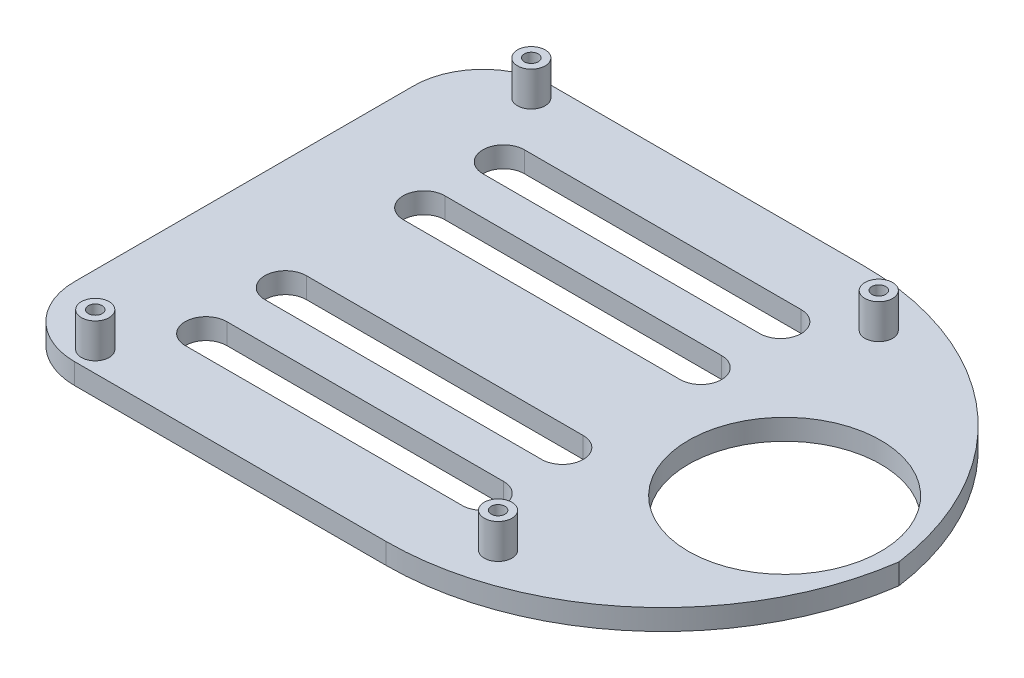
ISO-10303-21;
HEADER;
FILE_DESCRIPTION(('STEP AP214'),'2;1');
FILE_NAME('part.step','',(''),(''),'','','');
FILE_SCHEMA(('AUTOMOTIVE_DESIGN { 1 0 10303 214 1 1 1 1 }'));
ENDSEC;
DATA;
#1=APPLICATION_CONTEXT('core data for automotive mechanical design processes');
#2=APPLICATION_PROTOCOL_DEFINITION('international standard','automotive_design',2000,#1);
#3=PRODUCT_CONTEXT('',#1,'mechanical');
#4=PRODUCT('Part','Part','',(#3));
#5=PRODUCT_RELATED_PRODUCT_CATEGORY('part','',(#4));
#6=PRODUCT_DEFINITION_FORMATION('','',#4);
#7=PRODUCT_DEFINITION_CONTEXT('part definition',#1,'design');
#8=PRODUCT_DEFINITION('design','',#6,#7);
#9=PRODUCT_DEFINITION_SHAPE('','',#8);
#10=(LENGTH_UNIT() NAMED_UNIT(*) SI_UNIT(.MILLI.,.METRE.));
#11=(NAMED_UNIT(*) PLANE_ANGLE_UNIT() SI_UNIT($,.RADIAN.));
#12=(NAMED_UNIT(*) SI_UNIT($,.STERADIAN.) SOLID_ANGLE_UNIT());
#13=UNCERTAINTY_MEASURE_WITH_UNIT(LENGTH_MEASURE(1.E-05),#10,'distance_accuracy_value','');
#14=(GEOMETRIC_REPRESENTATION_CONTEXT(3) GLOBAL_UNCERTAINTY_ASSIGNED_CONTEXT((#13)) GLOBAL_UNIT_ASSIGNED_CONTEXT((#10,
#11,#12)) REPRESENTATION_CONTEXT('',''));
#15=CARTESIAN_POINT('',(0.,0.,0.));
#16=DIRECTION('',(0.,0.,1.));
#17=DIRECTION('',(1.,0.,0.));
#18=AXIS2_PLACEMENT_3D('',#15,#16,#17);
#19=CARTESIAN_POINT('',(-47.5,3.,-34.5));
#20=DIRECTION('',(0.,0.,1.));
#21=DIRECTION('',(1.,0.,0.));
#22=AXIS2_PLACEMENT_3D('',#19,#20,#21);
#23=PLANE('',#22);
#24=DIRECTION('',(-1.,0.,0.));
#25=VECTOR('',#24,1.);
#26=CARTESIAN_POINT('',(-47.5,0.,-34.5));
#27=LINE('',#26,#25);
#28=CARTESIAN_POINT('',(7.50000000000001,0.,-34.5));
#29=VERTEX_POINT('',#28);
#30=CARTESIAN_POINT('',(-37.5,0.,-34.5));
#31=VERTEX_POINT('',#30);
#32=EDGE_CURVE('E381',#29,#31,#27,.T.);
#33=ORIENTED_EDGE('',*,*,#32,.T.);
#34=DIRECTION('',(0.,-1.,0.));
#35=VECTOR('',#34,1.);
#36=CARTESIAN_POINT('',(-37.5,3.,-34.5));
#37=LINE('',#36,#35);
#38=CARTESIAN_POINT('',(-37.5,3.,-34.5));
#39=VERTEX_POINT('',#38);
#40=EDGE_CURVE('E11',#31,#39,#37,.F.);
#41=ORIENTED_EDGE('',*,*,#40,.T.);
#42=DIRECTION('',(-1.,0.,0.));
#43=VECTOR('',#42,1.);
#44=CARTESIAN_POINT('',(-47.5,3.,-34.5));
#45=LINE('',#44,#43);
#46=CARTESIAN_POINT('',(7.50000000000001,3.,-34.5));
#47=VERTEX_POINT('',#46);
#48=EDGE_CURVE('E383',#47,#39,#45,.T.);
#49=ORIENTED_EDGE('',*,*,#48,.F.);
#50=DIRECTION('',(0.,-1.,0.));
#51=VECTOR('',#50,1.);
#52=CARTESIAN_POINT('',(7.50000000000001,3.,-34.5));
#53=LINE('',#52,#51);
#54=EDGE_CURVE('E352',#47,#29,#53,.T.);
#55=ORIENTED_EDGE('',*,*,#54,.T.);
#56=EDGE_LOOP('',(#33,#41,#49,#55));
#57=FACE_BOUND('',#56,.T.);
#58=ADVANCED_FACE('F39',(#57),#23,.F.);
#59=CARTESIAN_POINT('',(-47.5,3.,34.5));
#60=DIRECTION('',(1.,0.,0.));
#61=DIRECTION('',(0.,0.,-1.));
#62=AXIS2_PLACEMENT_3D('',#59,#60,#61);
#63=PLANE('',#62);
#64=DIRECTION('',(0.,0.,1.));
#65=VECTOR('',#64,1.);
#66=CARTESIAN_POINT('',(-47.5,0.,34.5));
#67=LINE('',#66,#65);
#68=CARTESIAN_POINT('',(-47.5,0.,-24.5));
#69=VERTEX_POINT('',#68);
#70=CARTESIAN_POINT('',(-47.5,0.,24.5));
#71=VERTEX_POINT('',#70);
#72=EDGE_CURVE('E391',#69,#71,#67,.T.);
#73=ORIENTED_EDGE('',*,*,#72,.T.);
#74=DIRECTION('',(0.,-1.,0.));
#75=VECTOR('',#74,1.);
#76=CARTESIAN_POINT('',(-47.5,3.,24.5));
#77=LINE('',#76,#75);
#78=CARTESIAN_POINT('',(-47.5,3.,24.5));
#79=VERTEX_POINT('',#78);
#80=EDGE_CURVE('E424',#71,#79,#77,.F.);
#81=ORIENTED_EDGE('',*,*,#80,.T.);
#82=DIRECTION('',(0.,0.,1.));
#83=VECTOR('',#82,1.);
#84=CARTESIAN_POINT('',(-47.5,3.,34.5));
#85=LINE('',#84,#83);
#86=CARTESIAN_POINT('',(-47.5,3.,-24.5));
#87=VERTEX_POINT('',#86);
#88=EDGE_CURVE('E390',#87,#79,#85,.T.);
#89=ORIENTED_EDGE('',*,*,#88,.F.);
#90=DIRECTION('',(0.,-1.,0.));
#91=VECTOR('',#90,1.);
#92=CARTESIAN_POINT('',(-47.5,3.,-24.5));
#93=LINE('',#92,#91);
#94=EDGE_CURVE('E423',#87,#69,#93,.T.);
#95=ORIENTED_EDGE('',*,*,#94,.T.);
#96=EDGE_LOOP('',(#73,#81,#89,#95));
#97=FACE_BOUND('',#96,.T.);
#98=ADVANCED_FACE('F441',(#97),#63,.F.);
#99=CARTESIAN_POINT('',(-47.5,3.,34.5));
#100=DIRECTION('',(0.,0.,-1.));
#101=DIRECTION('',(-1.,0.,0.));
#102=AXIS2_PLACEMENT_3D('',#99,#100,#101);
#103=PLANE('',#102);
#104=DIRECTION('',(1.,0.,0.));
#105=VECTOR('',#104,1.);
#106=CARTESIAN_POINT('',(-47.5,3.,34.5));
#107=LINE('',#106,#105);
#108=CARTESIAN_POINT('',(-37.5,3.,34.5));
#109=VERTEX_POINT('',#108);
#110=CARTESIAN_POINT('',(7.50000000000001,3.,34.5));
#111=VERTEX_POINT('',#110);
#112=EDGE_CURVE('E364',#109,#111,#107,.T.);
#113=ORIENTED_EDGE('',*,*,#112,.F.);
#114=DIRECTION('',(0.,-1.,0.));
#115=VECTOR('',#114,1.);
#116=CARTESIAN_POINT('',(-37.5,3.,34.5));
#117=LINE('',#116,#115);
#118=CARTESIAN_POINT('',(-37.5,0.,34.5));
#119=VERTEX_POINT('',#118);
#120=EDGE_CURVE('E415',#109,#119,#117,.T.);
#121=ORIENTED_EDGE('',*,*,#120,.T.);
#122=DIRECTION('',(1.,0.,0.));
#123=VECTOR('',#122,1.);
#124=CARTESIAN_POINT('',(-47.5,0.,34.5));
#125=LINE('',#124,#123);
#126=CARTESIAN_POINT('',(7.50000000000001,0.,34.5));
#127=VERTEX_POINT('',#126);
#128=EDGE_CURVE('E389',#119,#127,#125,.T.);
#129=ORIENTED_EDGE('',*,*,#128,.T.);
#130=DIRECTION('',(0.,-1.,0.));
#131=VECTOR('',#130,1.);
#132=CARTESIAN_POINT('',(7.50000000000001,3.,34.5));
#133=LINE('',#132,#131);
#134=EDGE_CURVE('E406',#127,#111,#133,.F.);
#135=ORIENTED_EDGE('',*,*,#134,.T.);
#136=EDGE_LOOP('',(#113,#121,#129,#135));
#137=FACE_BOUND('',#136,.T.);
#138=ADVANCED_FACE('F436',(#137),#103,.F.);
#139=CARTESIAN_POINT('',(0.,3.,0.));
#140=DIRECTION('',(0.,-1.,0.));
#141=DIRECTION('',(0.,0.,-1.));
#142=AXIS2_PLACEMENT_3D('',#139,#140,#141);
#143=PLANE('',#142);
#144=DIRECTION('',(1.,0.,0.));
#145=VECTOR('',#144,1.);
#146=CARTESIAN_POINT('',(-31.5,3.,-18.5));
#147=LINE('',#146,#145);
#148=CARTESIAN_POINT('',(-31.5,3.,-18.5));
#149=VERTEX_POINT('',#148);
#150=CARTESIAN_POINT('',(8.5,3.,-18.5));
#151=VERTEX_POINT('',#150);
#152=EDGE_CURVE('E224',#149,#151,#147,.T.);
#153=ORIENTED_EDGE('',*,*,#152,.F.);
#154=CARTESIAN_POINT('',(-31.5,3.,-21.5));
#155=DIRECTION('',(0.,1.,0.));
#156=DIRECTION('',(0.,0.,1.));
#157=AXIS2_PLACEMENT_3D('',#154,#155,#156);
#158=CIRCLE('',#157,3.);
#159=CARTESIAN_POINT('',(-31.5,3.,-24.5));
#160=VERTEX_POINT('',#159);
#161=EDGE_CURVE('E53',#160,#149,#158,.T.);
#162=ORIENTED_EDGE('',*,*,#161,.F.);
#163=DIRECTION('',(-1.,0.,0.));
#164=VECTOR('',#163,1.);
#165=CARTESIAN_POINT('',(-31.5,3.,-24.5));
#166=LINE('',#165,#164);
#167=CARTESIAN_POINT('',(8.5,3.,-24.5));
#168=VERTEX_POINT('',#167);
#169=EDGE_CURVE('E212',#168,#160,#166,.T.);
#170=ORIENTED_EDGE('',*,*,#169,.F.);
#171=CARTESIAN_POINT('',(8.5,3.,-21.5));
#172=DIRECTION('',(0.,1.,0.));
#173=DIRECTION('',(0.,0.,1.));
#174=AXIS2_PLACEMENT_3D('',#171,#172,#173);
#175=CIRCLE('',#174,3.);
#176=EDGE_CURVE('E220',#151,#168,#175,.T.);
#177=ORIENTED_EDGE('',*,*,#176,.F.);
#178=EDGE_LOOP('',(#153,#162,#170,#177));
#179=FACE_BOUND('',#178,.T.);
#180=DIRECTION('',(1.,0.,0.));
#181=VECTOR('',#180,1.);
#182=CARTESIAN_POINT('',(-31.5,3.,13.));
#183=LINE('',#182,#181);
#184=CARTESIAN_POINT('',(-31.5,3.,13.));
#185=VERTEX_POINT('',#184);
#186=CARTESIAN_POINT('',(8.5,3.,13.));
#187=VERTEX_POINT('',#186);
#188=EDGE_CURVE('E249',#185,#187,#183,.T.);
#189=ORIENTED_EDGE('',*,*,#188,.F.);
#190=CARTESIAN_POINT('',(-31.5,3.,10.));
#191=DIRECTION('',(0.,1.,0.));
#192=DIRECTION('',(0.,0.,-1.));
#193=AXIS2_PLACEMENT_3D('',#190,#191,#192);
#194=CIRCLE('',#193,3.);
#195=CARTESIAN_POINT('',(-31.5,3.,7.));
#196=VERTEX_POINT('',#195);
#197=EDGE_CURVE('E64',#196,#185,#194,.T.);
#198=ORIENTED_EDGE('',*,*,#197,.F.);
#199=DIRECTION('',(-1.,0.,0.));
#200=VECTOR('',#199,1.);
#201=CARTESIAN_POINT('',(-31.5,3.,7.));
#202=LINE('',#201,#200);
#203=CARTESIAN_POINT('',(8.5,3.,7.));
#204=VERTEX_POINT('',#203);
#205=EDGE_CURVE('E245',#204,#196,#202,.T.);
#206=ORIENTED_EDGE('',*,*,#205,.F.);
#207=CARTESIAN_POINT('',(8.5,3.,10.));
#208=DIRECTION('',(0.,1.,0.));
#209=DIRECTION('',(0.,0.,-1.));
#210=AXIS2_PLACEMENT_3D('',#207,#208,#209);
#211=CIRCLE('',#210,3.);
#212=EDGE_CURVE('E246',#187,#204,#211,.T.);
#213=ORIENTED_EDGE('',*,*,#212,.F.);
#214=EDGE_LOOP('',(#189,#198,#206,#213));
#215=FACE_BOUND('',#214,.T.);
#216=DIRECTION('',(1.,0.,0.));
#217=VECTOR('',#216,1.);
#218=CARTESIAN_POINT('',(-31.5,3.,24.5));
#219=LINE('',#218,#217);
#220=CARTESIAN_POINT('',(-31.5,3.,24.5));
#221=VERTEX_POINT('',#220);
#222=CARTESIAN_POINT('',(8.5,3.,24.5));
#223=VERTEX_POINT('',#222);
#224=EDGE_CURVE('E311',#221,#223,#219,.T.);
#225=ORIENTED_EDGE('',*,*,#224,.F.);
#226=CARTESIAN_POINT('',(-31.5,3.,21.5));
#227=DIRECTION('',(0.,1.,0.));
#228=DIRECTION('',(0.,0.,-1.));
#229=AXIS2_PLACEMENT_3D('',#226,#227,#228);
#230=CIRCLE('',#229,3.);
#231=CARTESIAN_POINT('',(-31.5,3.,18.5));
#232=VERTEX_POINT('',#231);
#233=EDGE_CURVE('E274',#232,#221,#230,.T.);
#234=ORIENTED_EDGE('',*,*,#233,.F.);
#235=DIRECTION('',(-1.,0.,0.));
#236=VECTOR('',#235,1.);
#237=CARTESIAN_POINT('',(-31.5,3.,18.5));
#238=LINE('',#237,#236);
#239=CARTESIAN_POINT('',(8.5,3.,18.5));
#240=VERTEX_POINT('',#239);
#241=EDGE_CURVE('E308',#240,#232,#238,.T.);
#242=ORIENTED_EDGE('',*,*,#241,.F.);
#243=CARTESIAN_POINT('',(8.5,3.,21.5));
#244=DIRECTION('',(0.,1.,0.));
#245=DIRECTION('',(0.,0.,-1.));
#246=AXIS2_PLACEMENT_3D('',#243,#244,#245);
#247=CIRCLE('',#246,3.);
#248=EDGE_CURVE('E310',#223,#240,#247,.T.);
#249=ORIENTED_EDGE('',*,*,#248,.F.);
#250=EDGE_LOOP('',(#225,#234,#242,#249));
#251=FACE_BOUND('',#250,.T.);
#252=DIRECTION('',(1.,0.,0.));
#253=VECTOR('',#252,1.);
#254=CARTESIAN_POINT('',(-31.5,3.,-7.));
#255=LINE('',#254,#253);
#256=CARTESIAN_POINT('',(-31.5,3.,-7.));
#257=VERTEX_POINT('',#256);
#258=CARTESIAN_POINT('',(8.5,3.,-7.));
#259=VERTEX_POINT('',#258);
#260=EDGE_CURVE('E285',#257,#259,#255,.T.);
#261=ORIENTED_EDGE('',*,*,#260,.F.);
#262=CARTESIAN_POINT('',(-31.5,3.,-10.));
#263=DIRECTION('',(0.,1.,0.));
#264=DIRECTION('',(0.,0.,1.));
#265=AXIS2_PLACEMENT_3D('',#262,#263,#264);
#266=CIRCLE('',#265,3.);
#267=CARTESIAN_POINT('',(-31.5,3.,-13.));
#268=VERTEX_POINT('',#267);
#269=EDGE_CURVE('E221',#268,#257,#266,.T.);
#270=ORIENTED_EDGE('',*,*,#269,.F.);
#271=DIRECTION('',(-1.,0.,0.));
#272=VECTOR('',#271,1.);
#273=CARTESIAN_POINT('',(-31.5,3.,-13.));
#274=LINE('',#273,#272);
#275=CARTESIAN_POINT('',(8.5,3.,-13.));
#276=VERTEX_POINT('',#275);
#277=EDGE_CURVE('E277',#276,#268,#274,.T.);
#278=ORIENTED_EDGE('',*,*,#277,.F.);
#279=CARTESIAN_POINT('',(8.5,3.,-10.));
#280=DIRECTION('',(0.,1.,0.));
#281=DIRECTION('',(0.,0.,1.));
#282=AXIS2_PLACEMENT_3D('',#279,#280,#281);
#283=CIRCLE('',#282,3.);
#284=EDGE_CURVE('E276',#259,#276,#283,.T.);
#285=ORIENTED_EDGE('',*,*,#284,.F.);
#286=EDGE_LOOP('',(#261,#270,#278,#285));
#287=FACE_BOUND('',#286,.T.);
#288=CARTESIAN_POINT('',(-37.5,3.,31.5));
#289=DIRECTION('',(0.,1.,0.));
#290=DIRECTION('',(0.,0.,-1.));
#291=AXIS2_PLACEMENT_3D('',#288,#289,#290);
#292=CIRCLE('',#291,2.);
#293=CARTESIAN_POINT('',(-37.5,3.,29.5));
#294=VERTEX_POINT('',#293);
#295=EDGE_CURVE('E345',#294,#294,#292,.T.);
#296=ORIENTED_EDGE('',*,*,#295,.F.);
#297=EDGE_LOOP('',(#296));
#298=FACE_BOUND('',#297,.T.);
#299=CARTESIAN_POINT('',(16.7,3.,27.5));
#300=DIRECTION('',(0.,1.,0.));
#301=DIRECTION('',(0.,0.,-1.));
#302=AXIS2_PLACEMENT_3D('',#299,#300,#301);
#303=CIRCLE('',#302,2.);
#304=CARTESIAN_POINT('',(16.7,3.,25.5));
#305=VERTEX_POINT('',#304);
#306=EDGE_CURVE('E329',#305,#305,#303,.T.);
#307=ORIENTED_EDGE('',*,*,#306,.F.);
#308=EDGE_LOOP('',(#307));
#309=FACE_BOUND('',#308,.T.);
#310=CARTESIAN_POINT('',(16.7,3.,-27.5));
#311=DIRECTION('',(0.,1.,0.));
#312=DIRECTION('',(0.,0.,1.));
#313=AXIS2_PLACEMENT_3D('',#310,#311,#312);
#314=CIRCLE('',#313,2.);
#315=CARTESIAN_POINT('',(16.7,3.,-25.5));
#316=VERTEX_POINT('',#315);
#317=EDGE_CURVE('E330',#316,#316,#314,.T.);
#318=ORIENTED_EDGE('',*,*,#317,.F.);
#319=EDGE_LOOP('',(#318));
#320=FACE_BOUND('',#319,.T.);
#321=CARTESIAN_POINT('',(-37.5,3.,-31.5));
#322=DIRECTION('',(0.,1.,0.));
#323=DIRECTION('',(0.,0.,1.));
#324=AXIS2_PLACEMENT_3D('',#321,#322,#323);
#325=CIRCLE('',#324,2.);
#326=CARTESIAN_POINT('',(-37.5,3.,-29.5));
#327=VERTEX_POINT('',#326);
#328=EDGE_CURVE('E332',#327,#327,#325,.T.);
#329=ORIENTED_EDGE('',*,*,#328,.F.);
#330=EDGE_LOOP('',(#329));
#331=FACE_BOUND('',#330,.T.);
#332=CARTESIAN_POINT('',(30.6,3.,0.));
#333=DIRECTION('',(0.,1.,0.));
#334=DIRECTION('',(0.,0.,1.));
#335=AXIS2_PLACEMENT_3D('',#332,#333,#334);
#336=CIRCLE('',#335,13.9);
#337=CARTESIAN_POINT('',(30.6,3.,13.9));
#338=VERTEX_POINT('',#337);
#339=EDGE_CURVE('E380',#338,#338,#336,.T.);
#340=ORIENTED_EDGE('',*,*,#339,.F.);
#341=EDGE_LOOP('',(#340));
#342=FACE_BOUND('',#341,.T.);
#343=ORIENTED_EDGE('',*,*,#88,.T.);
#344=CARTESIAN_POINT('',(-37.5,3.,24.5));
#345=DIRECTION('',(0.,-1.,0.));
#346=DIRECTION('',(0.,0.,-1.));
#347=AXIS2_PLACEMENT_3D('',#344,#345,#346);
#348=CIRCLE('',#347,10.);
#349=EDGE_CURVE('E50',#79,#109,#348,.F.);
#350=ORIENTED_EDGE('',*,*,#349,.T.);
#351=ORIENTED_EDGE('',*,*,#112,.T.);
#352=CARTESIAN_POINT('',(7.50000000000001,3.,-5.5));
#353=DIRECTION('',(0.,-1.,0.));
#354=DIRECTION('',(0.,0.,-1.));
#355=AXIS2_PLACEMENT_3D('',#352,#353,#354);
#356=CIRCLE('',#355,40.);
#357=CARTESIAN_POINT('',(47.1200706713151,3.,0.));
#358=VERTEX_POINT('',#357);
#359=EDGE_CURVE('E403',#111,#358,#356,.F.);
#360=ORIENTED_EDGE('',*,*,#359,.T.);
#361=CARTESIAN_POINT('',(7.50000000000001,3.,5.5));
#362=DIRECTION('',(0.,-1.,0.));
#363=DIRECTION('',(0.,0.,-1.));
#364=AXIS2_PLACEMENT_3D('',#361,#362,#363);
#365=CIRCLE('',#364,40.);
#366=EDGE_CURVE('E409',#358,#47,#365,.F.);
#367=ORIENTED_EDGE('',*,*,#366,.T.);
#368=ORIENTED_EDGE('',*,*,#48,.T.);
#369=CARTESIAN_POINT('',(-37.5,3.,-24.5));
#370=DIRECTION('',(0.,-1.,0.));
#371=DIRECTION('',(0.,0.,-1.));
#372=AXIS2_PLACEMENT_3D('',#369,#370,#371);
#373=CIRCLE('',#372,10.);
#374=EDGE_CURVE('E426',#39,#87,#373,.F.);
#375=ORIENTED_EDGE('',*,*,#374,.T.);
#376=EDGE_LOOP('',(#343,#350,#351,#360,#367,#368,#375));
#377=FACE_BOUND('',#376,.T.);
#378=ADVANCED_FACE('F429',(#179,#215,#251,#287,#298,#309,#320,#331,#342,#377),#143,.F.);
#379=CARTESIAN_POINT('',(0.,0.,0.));
#380=DIRECTION('',(0.,-1.,0.));
#381=DIRECTION('',(0.,0.,-1.));
#382=AXIS2_PLACEMENT_3D('',#379,#380,#381);
#383=PLANE('',#382);
#384=CARTESIAN_POINT('',(-31.5,0.,-21.5));
#385=DIRECTION('',(0.,1.,0.));
#386=DIRECTION('',(0.,0.,1.));
#387=AXIS2_PLACEMENT_3D('',#384,#385,#386);
#388=CIRCLE('',#387,3.);
#389=CARTESIAN_POINT('',(-31.5,0.,-24.5));
#390=VERTEX_POINT('',#389);
#391=CARTESIAN_POINT('',(-31.5,0.,-18.5));
#392=VERTEX_POINT('',#391);
#393=EDGE_CURVE('E194',#390,#392,#388,.T.);
#394=ORIENTED_EDGE('',*,*,#393,.T.);
#395=DIRECTION('',(1.,0.,0.));
#396=VECTOR('',#395,1.);
#397=CARTESIAN_POINT('',(-31.5,0.,-18.5));
#398=LINE('',#397,#396);
#399=CARTESIAN_POINT('',(8.5,0.,-18.5));
#400=VERTEX_POINT('',#399);
#401=EDGE_CURVE('E202',#392,#400,#398,.T.);
#402=ORIENTED_EDGE('',*,*,#401,.T.);
#403=CARTESIAN_POINT('',(8.5,0.,-21.5));
#404=DIRECTION('',(0.,1.,0.));
#405=DIRECTION('',(0.,0.,1.));
#406=AXIS2_PLACEMENT_3D('',#403,#404,#405);
#407=CIRCLE('',#406,3.);
#408=CARTESIAN_POINT('',(8.5,0.,-24.5));
#409=VERTEX_POINT('',#408);
#410=EDGE_CURVE('E207',#400,#409,#407,.T.);
#411=ORIENTED_EDGE('',*,*,#410,.T.);
#412=DIRECTION('',(-1.,0.,0.));
#413=VECTOR('',#412,1.);
#414=CARTESIAN_POINT('',(-31.5,0.,-24.5));
#415=LINE('',#414,#413);
#416=EDGE_CURVE('E203',#409,#390,#415,.T.);
#417=ORIENTED_EDGE('',*,*,#416,.T.);
#418=EDGE_LOOP('',(#394,#402,#411,#417));
#419=FACE_BOUND('',#418,.T.);
#420=CARTESIAN_POINT('',(-31.5,0.,10.));
#421=DIRECTION('',(0.,1.,0.));
#422=DIRECTION('',(0.,0.,-1.));
#423=AXIS2_PLACEMENT_3D('',#420,#421,#422);
#424=CIRCLE('',#423,3.);
#425=CARTESIAN_POINT('',(-31.5,0.,7.));
#426=VERTEX_POINT('',#425);
#427=CARTESIAN_POINT('',(-31.5,0.,13.));
#428=VERTEX_POINT('',#427);
#429=EDGE_CURVE('E250',#426,#428,#424,.T.);
#430=ORIENTED_EDGE('',*,*,#429,.T.);
#431=DIRECTION('',(1.,0.,0.));
#432=VECTOR('',#431,1.);
#433=CARTESIAN_POINT('',(-31.5,0.,13.));
#434=LINE('',#433,#432);
#435=CARTESIAN_POINT('',(8.5,0.,13.));
#436=VERTEX_POINT('',#435);
#437=EDGE_CURVE('E257',#428,#436,#434,.T.);
#438=ORIENTED_EDGE('',*,*,#437,.T.);
#439=CARTESIAN_POINT('',(8.5,0.,10.));
#440=DIRECTION('',(0.,1.,0.));
#441=DIRECTION('',(0.,0.,-1.));
#442=AXIS2_PLACEMENT_3D('',#439,#440,#441);
#443=CIRCLE('',#442,3.);
#444=CARTESIAN_POINT('',(8.5,0.,7.));
#445=VERTEX_POINT('',#444);
#446=EDGE_CURVE('E260',#436,#445,#443,.T.);
#447=ORIENTED_EDGE('',*,*,#446,.T.);
#448=DIRECTION('',(-1.,0.,0.));
#449=VECTOR('',#448,1.);
#450=CARTESIAN_POINT('',(-31.5,0.,7.));
#451=LINE('',#450,#449);
#452=EDGE_CURVE('E237',#445,#426,#451,.T.);
#453=ORIENTED_EDGE('',*,*,#452,.T.);
#454=EDGE_LOOP('',(#430,#438,#447,#453));
#455=FACE_BOUND('',#454,.T.);
#456=CARTESIAN_POINT('',(-31.5,0.,21.5));
#457=DIRECTION('',(0.,1.,0.));
#458=DIRECTION('',(0.,0.,-1.));
#459=AXIS2_PLACEMENT_3D('',#456,#457,#458);
#460=CIRCLE('',#459,3.);
#461=CARTESIAN_POINT('',(-31.5,0.,18.5));
#462=VERTEX_POINT('',#461);
#463=CARTESIAN_POINT('',(-31.5,0.,24.5));
#464=VERTEX_POINT('',#463);
#465=EDGE_CURVE('E309',#462,#464,#460,.T.);
#466=ORIENTED_EDGE('',*,*,#465,.T.);
#467=DIRECTION('',(1.,0.,0.));
#468=VECTOR('',#467,1.);
#469=CARTESIAN_POINT('',(-31.5,0.,24.5));
#470=LINE('',#469,#468);
#471=CARTESIAN_POINT('',(8.5,0.,24.5));
#472=VERTEX_POINT('',#471);
#473=EDGE_CURVE('E325',#464,#472,#470,.T.);
#474=ORIENTED_EDGE('',*,*,#473,.T.);
#475=CARTESIAN_POINT('',(8.5,0.,21.5));
#476=DIRECTION('',(0.,1.,0.));
#477=DIRECTION('',(0.,0.,-1.));
#478=AXIS2_PLACEMENT_3D('',#475,#476,#477);
#479=CIRCLE('',#478,3.);
#480=CARTESIAN_POINT('',(8.5,0.,18.5));
#481=VERTEX_POINT('',#480);
#482=EDGE_CURVE('E317',#472,#481,#479,.T.);
#483=ORIENTED_EDGE('',*,*,#482,.T.);
#484=DIRECTION('',(-1.,0.,0.));
#485=VECTOR('',#484,1.);
#486=CARTESIAN_POINT('',(-31.5,0.,18.5));
#487=LINE('',#486,#485);
#488=EDGE_CURVE('E298',#481,#462,#487,.T.);
#489=ORIENTED_EDGE('',*,*,#488,.T.);
#490=EDGE_LOOP('',(#466,#474,#483,#489));
#491=FACE_BOUND('',#490,.T.);
#492=CARTESIAN_POINT('',(-31.5,0.,-10.));
#493=DIRECTION('',(0.,1.,0.));
#494=DIRECTION('',(0.,0.,1.));
#495=AXIS2_PLACEMENT_3D('',#492,#493,#494);
#496=CIRCLE('',#495,3.);
#497=CARTESIAN_POINT('',(-31.5,0.,-13.));
#498=VERTEX_POINT('',#497);
#499=CARTESIAN_POINT('',(-31.5,0.,-7.));
#500=VERTEX_POINT('',#499);
#501=EDGE_CURVE('E278',#498,#500,#496,.T.);
#502=ORIENTED_EDGE('',*,*,#501,.T.);
#503=DIRECTION('',(1.,0.,0.));
#504=VECTOR('',#503,1.);
#505=CARTESIAN_POINT('',(-31.5,0.,-7.));
#506=LINE('',#505,#504);
#507=CARTESIAN_POINT('',(8.5,0.,-7.));
#508=VERTEX_POINT('',#507);
#509=EDGE_CURVE('E295',#500,#508,#506,.T.);
#510=ORIENTED_EDGE('',*,*,#509,.T.);
#511=CARTESIAN_POINT('',(8.5,0.,-10.));
#512=DIRECTION('',(0.,1.,0.));
#513=DIRECTION('',(0.,0.,1.));
#514=AXIS2_PLACEMENT_3D('',#511,#512,#513);
#515=CIRCLE('',#514,3.);
#516=CARTESIAN_POINT('',(8.5,0.,-13.));
#517=VERTEX_POINT('',#516);
#518=EDGE_CURVE('E288',#508,#517,#515,.T.);
#519=ORIENTED_EDGE('',*,*,#518,.T.);
#520=DIRECTION('',(-1.,0.,0.));
#521=VECTOR('',#520,1.);
#522=CARTESIAN_POINT('',(-31.5,0.,-13.));
#523=LINE('',#522,#521);
#524=EDGE_CURVE('E268',#517,#498,#523,.T.);
#525=ORIENTED_EDGE('',*,*,#524,.T.);
#526=EDGE_LOOP('',(#502,#510,#519,#525));
#527=FACE_BOUND('',#526,.T.);
#528=CARTESIAN_POINT('',(-37.5,0.,31.5));
#529=DIRECTION('',(0.,1.,0.));
#530=DIRECTION('',(0.,0.,-1.));
#531=AXIS2_PLACEMENT_3D('',#528,#529,#530);
#532=CIRCLE('',#531,0.999999999999998);
#533=CARTESIAN_POINT('',(-37.5,0.,30.5));
#534=VERTEX_POINT('',#533);
#535=EDGE_CURVE('E362',#534,#534,#532,.T.);
#536=ORIENTED_EDGE('',*,*,#535,.T.);
#537=EDGE_LOOP('',(#536));
#538=FACE_BOUND('',#537,.T.);
#539=CARTESIAN_POINT('',(-37.5,0.,-31.5));
#540=DIRECTION('',(0.,1.,0.));
#541=DIRECTION('',(0.,0.,1.));
#542=AXIS2_PLACEMENT_3D('',#539,#540,#541);
#543=CIRCLE('',#542,0.999999999999998);
#544=CARTESIAN_POINT('',(-37.5,0.,-30.5));
#545=VERTEX_POINT('',#544);
#546=EDGE_CURVE('E367',#545,#545,#543,.T.);
#547=ORIENTED_EDGE('',*,*,#546,.T.);
#548=EDGE_LOOP('',(#547));
#549=FACE_BOUND('',#548,.T.);
#550=CARTESIAN_POINT('',(16.7,0.,27.5));
#551=DIRECTION('',(0.,1.,0.));
#552=DIRECTION('',(0.,0.,-1.));
#553=AXIS2_PLACEMENT_3D('',#550,#551,#552);
#554=CIRCLE('',#553,1.);
#555=CARTESIAN_POINT('',(16.7,0.,26.5));
#556=VERTEX_POINT('',#555);
#557=EDGE_CURVE('E368',#556,#556,#554,.T.);
#558=ORIENTED_EDGE('',*,*,#557,.T.);
#559=EDGE_LOOP('',(#558));
#560=FACE_BOUND('',#559,.T.);
#561=CARTESIAN_POINT('',(16.7,0.,-27.5));
#562=DIRECTION('',(0.,1.,0.));
#563=DIRECTION('',(0.,0.,1.));
#564=AXIS2_PLACEMENT_3D('',#561,#562,#563);
#565=CIRCLE('',#564,1.);
#566=CARTESIAN_POINT('',(16.7,0.,-26.5));
#567=VERTEX_POINT('',#566);
#568=EDGE_CURVE('E369',#567,#567,#565,.T.);
#569=ORIENTED_EDGE('',*,*,#568,.T.);
#570=EDGE_LOOP('',(#569));
#571=FACE_BOUND('',#570,.T.);
#572=CARTESIAN_POINT('',(30.6,0.,0.));
#573=DIRECTION('',(0.,1.,0.));
#574=DIRECTION('',(0.,0.,1.));
#575=AXIS2_PLACEMENT_3D('',#572,#573,#574);
#576=CIRCLE('',#575,13.9);
#577=CARTESIAN_POINT('',(30.6,0.,13.9));
#578=VERTEX_POINT('',#577);
#579=EDGE_CURVE('E378',#578,#578,#576,.T.);
#580=ORIENTED_EDGE('',*,*,#579,.T.);
#581=EDGE_LOOP('',(#580));
#582=FACE_BOUND('',#581,.T.);
#583=ORIENTED_EDGE('',*,*,#128,.F.);
#584=CARTESIAN_POINT('',(-37.5,0.,24.5));
#585=DIRECTION('',(0.,-1.,0.));
#586=DIRECTION('',(0.,0.,-1.));
#587=AXIS2_PLACEMENT_3D('',#584,#585,#586);
#588=CIRCLE('',#587,10.);
#589=EDGE_CURVE('E420',#119,#71,#588,.T.);
#590=ORIENTED_EDGE('',*,*,#589,.T.);
#591=ORIENTED_EDGE('',*,*,#72,.F.);
#592=CARTESIAN_POINT('',(-37.5,0.,-24.5));
#593=DIRECTION('',(0.,-1.,0.));
#594=DIRECTION('',(0.,0.,-1.));
#595=AXIS2_PLACEMENT_3D('',#592,#593,#594);
#596=CIRCLE('',#595,10.);
#597=EDGE_CURVE('E417',#69,#31,#596,.T.);
#598=ORIENTED_EDGE('',*,*,#597,.T.);
#599=ORIENTED_EDGE('',*,*,#32,.F.);
#600=CARTESIAN_POINT('',(7.50000000000001,0.,5.5));
#601=DIRECTION('',(0.,-1.,0.));
#602=DIRECTION('',(0.,0.,-1.));
#603=AXIS2_PLACEMENT_3D('',#600,#601,#602);
#604=CIRCLE('',#603,40.);
#605=CARTESIAN_POINT('',(47.1200706713151,0.,0.));
#606=VERTEX_POINT('',#605);
#607=EDGE_CURVE('E401',#29,#606,#604,.T.);
#608=ORIENTED_EDGE('',*,*,#607,.T.);
#609=CARTESIAN_POINT('',(7.50000000000001,0.,-5.5));
#610=DIRECTION('',(0.,-1.,0.));
#611=DIRECTION('',(0.,0.,-1.));
#612=AXIS2_PLACEMENT_3D('',#609,#610,#611);
#613=CIRCLE('',#612,40.);
#614=EDGE_CURVE('E399',#606,#127,#613,.T.);
#615=ORIENTED_EDGE('',*,*,#614,.T.);
#616=EDGE_LOOP('',(#583,#590,#591,#598,#599,#608,#615));
#617=FACE_BOUND('',#616,.T.);
#618=ADVANCED_FACE('F211',(#419,#455,#491,#527,#538,#549,#560,#571,#582,#617),#383,.T.);
#619=CARTESIAN_POINT('',(30.6,0.,0.));
#620=DIRECTION('',(0.,1.,0.));
#621=DIRECTION('',(0.,0.,1.));
#622=AXIS2_PLACEMENT_3D('',#619,#620,#621);
#623=CYLINDRICAL_SURFACE('',#622,13.9);
#624=ORIENTED_EDGE('',*,*,#579,.F.);
#625=EDGE_LOOP('',(#624));
#626=FACE_BOUND('',#625,.T.);
#627=ORIENTED_EDGE('',*,*,#339,.T.);
#628=EDGE_LOOP('',(#627));
#629=FACE_BOUND('',#628,.T.);
#630=ADVANCED_FACE('F485',(#626,#629),#623,.F.);
#631=CARTESIAN_POINT('',(16.7,0.,-27.5));
#632=DIRECTION('',(0.,1.,0.));
#633=DIRECTION('',(0.,0.,1.));
#634=AXIS2_PLACEMENT_3D('',#631,#632,#633);
#635=CYLINDRICAL_SURFACE('',#634,1.);
#636=ORIENTED_EDGE('',*,*,#568,.F.);
#637=EDGE_LOOP('',(#636));
#638=FACE_BOUND('',#637,.T.);
#639=CARTESIAN_POINT('',(16.7,8.,-27.5));
#640=DIRECTION('',(0.,1.,0.));
#641=DIRECTION('',(0.,0.,1.));
#642=AXIS2_PLACEMENT_3D('',#639,#640,#641);
#643=CIRCLE('',#642,1.);
#644=CARTESIAN_POINT('',(16.7,8.,-26.5));
#645=VERTEX_POINT('',#644);
#646=EDGE_CURVE('E333',#645,#645,#643,.T.);
#647=ORIENTED_EDGE('',*,*,#646,.T.);
#648=EDGE_LOOP('',(#647));
#649=FACE_BOUND('',#648,.T.);
#650=ADVANCED_FACE('F488',(#638,#649),#635,.F.);
#651=CARTESIAN_POINT('',(16.7,0.,27.5));
#652=DIRECTION('',(0.,1.,0.));
#653=DIRECTION('',(0.,0.,1.));
#654=AXIS2_PLACEMENT_3D('',#651,#652,#653);
#655=CYLINDRICAL_SURFACE('',#654,1.);
#656=ORIENTED_EDGE('',*,*,#557,.F.);
#657=EDGE_LOOP('',(#656));
#658=FACE_BOUND('',#657,.T.);
#659=CARTESIAN_POINT('',(16.7,8.,27.5));
#660=DIRECTION('',(0.,1.,0.));
#661=DIRECTION('',(0.,0.,-1.));
#662=AXIS2_PLACEMENT_3D('',#659,#660,#661);
#663=CIRCLE('',#662,1.);
#664=CARTESIAN_POINT('',(16.7,8.,26.5));
#665=VERTEX_POINT('',#664);
#666=EDGE_CURVE('E337',#665,#665,#663,.T.);
#667=ORIENTED_EDGE('',*,*,#666,.T.);
#668=EDGE_LOOP('',(#667));
#669=FACE_BOUND('',#668,.T.);
#670=ADVANCED_FACE('F495',(#658,#669),#655,.F.);
#671=CARTESIAN_POINT('',(-37.5,0.,-31.5));
#672=DIRECTION('',(0.,1.,0.));
#673=DIRECTION('',(0.,0.,1.));
#674=AXIS2_PLACEMENT_3D('',#671,#672,#673);
#675=CYLINDRICAL_SURFACE('',#674,0.999999999999998);
#676=ORIENTED_EDGE('',*,*,#546,.F.);
#677=EDGE_LOOP('',(#676));
#678=FACE_BOUND('',#677,.T.);
#679=CARTESIAN_POINT('',(-37.5,8.,-31.5));
#680=DIRECTION('',(0.,1.,0.));
#681=DIRECTION('',(0.,0.,1.));
#682=AXIS2_PLACEMENT_3D('',#679,#680,#681);
#683=CIRCLE('',#682,0.999999999999998);
#684=CARTESIAN_POINT('',(-37.5,8.,-30.5));
#685=VERTEX_POINT('',#684);
#686=EDGE_CURVE('E336',#685,#685,#683,.T.);
#687=ORIENTED_EDGE('',*,*,#686,.T.);
#688=EDGE_LOOP('',(#687));
#689=FACE_BOUND('',#688,.T.);
#690=ADVANCED_FACE('F499',(#678,#689),#675,.F.);
#691=CARTESIAN_POINT('',(-37.5,0.,31.5));
#692=DIRECTION('',(0.,1.,0.));
#693=DIRECTION('',(0.,0.,1.));
#694=AXIS2_PLACEMENT_3D('',#691,#692,#693);
#695=CYLINDRICAL_SURFACE('',#694,0.999999999999998);
#696=ORIENTED_EDGE('',*,*,#535,.F.);
#697=EDGE_LOOP('',(#696));
#698=FACE_BOUND('',#697,.T.);
#699=CARTESIAN_POINT('',(-37.5,8.,31.5));
#700=DIRECTION('',(0.,1.,0.));
#701=DIRECTION('',(0.,0.,-1.));
#702=AXIS2_PLACEMENT_3D('',#699,#700,#701);
#703=CIRCLE('',#702,0.999999999999998);
#704=CARTESIAN_POINT('',(-37.5,8.,30.5));
#705=VERTEX_POINT('',#704);
#706=EDGE_CURVE('E347',#705,#705,#703,.T.);
#707=ORIENTED_EDGE('',*,*,#706,.T.);
#708=EDGE_LOOP('',(#707));
#709=FACE_BOUND('',#708,.T.);
#710=ADVANCED_FACE('F493',(#698,#709),#695,.F.);
#711=CARTESIAN_POINT('',(-37.5,8.,-31.5));
#712=DIRECTION('',(0.,1.,0.));
#713=DIRECTION('',(0.,0.,1.));
#714=AXIS2_PLACEMENT_3D('',#711,#712,#713);
#715=PLANE('',#714);
#716=CARTESIAN_POINT('',(-37.5,8.,-31.5));
#717=DIRECTION('',(0.,1.,0.));
#718=DIRECTION('',(0.,0.,1.));
#719=AXIS2_PLACEMENT_3D('',#716,#717,#718);
#720=CIRCLE('',#719,2.);
#721=CARTESIAN_POINT('',(-37.5,8.,-29.5));
#722=VERTEX_POINT('',#721);
#723=EDGE_CURVE('E358',#722,#722,#720,.T.);
#724=ORIENTED_EDGE('',*,*,#723,.T.);
#725=EDGE_LOOP('',(#724));
#726=FACE_BOUND('',#725,.T.);
#727=ORIENTED_EDGE('',*,*,#686,.F.);
#728=EDGE_LOOP('',(#727));
#729=FACE_BOUND('',#728,.T.);
#730=ADVANCED_FACE('F500',(#726,#729),#715,.T.);
#731=CARTESIAN_POINT('',(-37.5,8.,-31.5));
#732=DIRECTION('',(0.,-1.,0.));
#733=DIRECTION('',(0.,0.,-1.));
#734=AXIS2_PLACEMENT_3D('',#731,#732,#733);
#735=CYLINDRICAL_SURFACE('',#734,2.);
#736=ORIENTED_EDGE('',*,*,#723,.F.);
#737=EDGE_LOOP('',(#736));
#738=FACE_BOUND('',#737,.T.);
#739=ORIENTED_EDGE('',*,*,#328,.T.);
#740=EDGE_LOOP('',(#739));
#741=FACE_BOUND('',#740,.T.);
#742=ADVANCED_FACE('F506',(#738,#741),#735,.T.);
#743=CARTESIAN_POINT('',(16.7,8.,-27.5));
#744=DIRECTION('',(0.,1.,0.));
#745=DIRECTION('',(0.,0.,1.));
#746=AXIS2_PLACEMENT_3D('',#743,#744,#745);
#747=PLANE('',#746);
#748=CARTESIAN_POINT('',(16.7,8.,-27.5));
#749=DIRECTION('',(0.,1.,0.));
#750=DIRECTION('',(0.,0.,1.));
#751=AXIS2_PLACEMENT_3D('',#748,#749,#750);
#752=CIRCLE('',#751,2.);
#753=CARTESIAN_POINT('',(16.7,8.,-25.5));
#754=VERTEX_POINT('',#753);
#755=EDGE_CURVE('E335',#754,#754,#752,.T.);
#756=ORIENTED_EDGE('',*,*,#755,.T.);
#757=EDGE_LOOP('',(#756));
#758=FACE_BOUND('',#757,.T.);
#759=ORIENTED_EDGE('',*,*,#646,.F.);
#760=EDGE_LOOP('',(#759));
#761=FACE_BOUND('',#760,.T.);
#762=ADVANCED_FACE('F508',(#758,#761),#747,.T.);
#763=CARTESIAN_POINT('',(16.7,8.,-27.5));
#764=DIRECTION('',(0.,-1.,0.));
#765=DIRECTION('',(0.,0.,-1.));
#766=AXIS2_PLACEMENT_3D('',#763,#764,#765);
#767=CYLINDRICAL_SURFACE('',#766,2.);
#768=ORIENTED_EDGE('',*,*,#755,.F.);
#769=EDGE_LOOP('',(#768));
#770=FACE_BOUND('',#769,.T.);
#771=ORIENTED_EDGE('',*,*,#317,.T.);
#772=EDGE_LOOP('',(#771));
#773=FACE_BOUND('',#772,.T.);
#774=ADVANCED_FACE('F521',(#770,#773),#767,.T.);
#775=CARTESIAN_POINT('',(16.7,8.,27.5));
#776=DIRECTION('',(0.,-1.,0.));
#777=DIRECTION('',(0.,0.,-1.));
#778=AXIS2_PLACEMENT_3D('',#775,#776,#777);
#779=PLANE('',#778);
#780=CARTESIAN_POINT('',(16.7,8.,27.5));
#781=DIRECTION('',(0.,1.,0.));
#782=DIRECTION('',(0.,0.,-1.));
#783=AXIS2_PLACEMENT_3D('',#780,#781,#782);
#784=CIRCLE('',#783,2.);
#785=CARTESIAN_POINT('',(16.7,8.,25.5));
#786=VERTEX_POINT('',#785);
#787=EDGE_CURVE('E342',#786,#786,#784,.T.);
#788=ORIENTED_EDGE('',*,*,#787,.T.);
#789=EDGE_LOOP('',(#788));
#790=FACE_BOUND('',#789,.T.);
#791=ORIENTED_EDGE('',*,*,#666,.F.);
#792=EDGE_LOOP('',(#791));
#793=FACE_BOUND('',#792,.T.);
#794=ADVANCED_FACE('F520',(#790,#793),#779,.F.);
#795=CARTESIAN_POINT('',(16.7,8.,27.5));
#796=DIRECTION('',(0.,-1.,0.));
#797=DIRECTION('',(0.,0.,-1.));
#798=AXIS2_PLACEMENT_3D('',#795,#796,#797);
#799=CYLINDRICAL_SURFACE('',#798,2.);
#800=ORIENTED_EDGE('',*,*,#787,.F.);
#801=EDGE_LOOP('',(#800));
#802=FACE_BOUND('',#801,.T.);
#803=ORIENTED_EDGE('',*,*,#306,.T.);
#804=EDGE_LOOP('',(#803));
#805=FACE_BOUND('',#804,.T.);
#806=ADVANCED_FACE('F513',(#802,#805),#799,.T.);
#807=CARTESIAN_POINT('',(-37.5,8.,31.5));
#808=DIRECTION('',(0.,-1.,0.));
#809=DIRECTION('',(0.,0.,-1.));
#810=AXIS2_PLACEMENT_3D('',#807,#808,#809);
#811=PLANE('',#810);
#812=CARTESIAN_POINT('',(-37.5,8.,31.5));
#813=DIRECTION('',(0.,1.,0.));
#814=DIRECTION('',(0.,0.,-1.));
#815=AXIS2_PLACEMENT_3D('',#812,#813,#814);
#816=CIRCLE('',#815,2.);
#817=CARTESIAN_POINT('',(-37.5,8.,29.5));
#818=VERTEX_POINT('',#817);
#819=EDGE_CURVE('E354',#818,#818,#816,.T.);
#820=ORIENTED_EDGE('',*,*,#819,.T.);
#821=EDGE_LOOP('',(#820));
#822=FACE_BOUND('',#821,.T.);
#823=ORIENTED_EDGE('',*,*,#706,.F.);
#824=EDGE_LOOP('',(#823));
#825=FACE_BOUND('',#824,.T.);
#826=ADVANCED_FACE('F467',(#822,#825),#811,.F.);
#827=CARTESIAN_POINT('',(-37.5,8.,31.5));
#828=DIRECTION('',(0.,-1.,0.));
#829=DIRECTION('',(0.,0.,-1.));
#830=AXIS2_PLACEMENT_3D('',#827,#828,#829);
#831=CYLINDRICAL_SURFACE('',#830,2.);
#832=ORIENTED_EDGE('',*,*,#819,.F.);
#833=EDGE_LOOP('',(#832));
#834=FACE_BOUND('',#833,.T.);
#835=ORIENTED_EDGE('',*,*,#295,.T.);
#836=EDGE_LOOP('',(#835));
#837=FACE_BOUND('',#836,.T.);
#838=ADVANCED_FACE('F462',(#834,#837),#831,.T.);
#839=CARTESIAN_POINT('',(7.50000000000001,3.,-5.5));
#840=DIRECTION('',(0.,-1.,0.));
#841=DIRECTION('',(0.,0.,-1.));
#842=AXIS2_PLACEMENT_3D('',#839,#840,#841);
#843=CYLINDRICAL_SURFACE('',#842,40.);
#844=DIRECTION('',(0.,-1.,0.));
#845=VECTOR('',#844,1.);
#846=CARTESIAN_POINT('',(47.1200706713151,1.5,0.));
#847=LINE('',#846,#845);
#848=EDGE_CURVE('E228',#358,#606,#847,.T.);
#849=ORIENTED_EDGE('',*,*,#848,.F.);
#850=ORIENTED_EDGE('',*,*,#359,.F.);
#851=ORIENTED_EDGE('',*,*,#134,.F.);
#852=ORIENTED_EDGE('',*,*,#614,.F.);
#853=EDGE_LOOP('',(#849,#850,#851,#852));
#854=FACE_BOUND('',#853,.T.);
#855=ADVANCED_FACE('F459',(#854),#843,.T.);
#856=CARTESIAN_POINT('',(7.50000000000001,3.,5.5));
#857=DIRECTION('',(0.,-1.,0.));
#858=DIRECTION('',(0.,0.,-1.));
#859=AXIS2_PLACEMENT_3D('',#856,#857,#858);
#860=CYLINDRICAL_SURFACE('',#859,40.);
#861=ORIENTED_EDGE('',*,*,#366,.F.);
#862=ORIENTED_EDGE('',*,*,#848,.T.);
#863=ORIENTED_EDGE('',*,*,#607,.F.);
#864=ORIENTED_EDGE('',*,*,#54,.F.);
#865=EDGE_LOOP('',(#861,#862,#863,#864));
#866=FACE_BOUND('',#865,.T.);
#867=ADVANCED_FACE('F454',(#866),#860,.T.);
#868=CARTESIAN_POINT('',(-37.5,3.,24.5));
#869=DIRECTION('',(0.,-1.,0.));
#870=DIRECTION('',(0.,0.,-1.));
#871=AXIS2_PLACEMENT_3D('',#868,#869,#870);
#872=CYLINDRICAL_SURFACE('',#871,10.);
#873=ORIENTED_EDGE('',*,*,#349,.F.);
#874=ORIENTED_EDGE('',*,*,#80,.F.);
#875=ORIENTED_EDGE('',*,*,#589,.F.);
#876=ORIENTED_EDGE('',*,*,#120,.F.);
#877=EDGE_LOOP('',(#873,#874,#875,#876));
#878=FACE_BOUND('',#877,.T.);
#879=ADVANCED_FACE('F439',(#878),#872,.T.);
#880=CARTESIAN_POINT('',(-37.5,3.,-24.5));
#881=DIRECTION('',(0.,-1.,0.));
#882=DIRECTION('',(0.,0.,-1.));
#883=AXIS2_PLACEMENT_3D('',#880,#881,#882);
#884=CYLINDRICAL_SURFACE('',#883,10.);
#885=ORIENTED_EDGE('',*,*,#374,.F.);
#886=ORIENTED_EDGE('',*,*,#40,.F.);
#887=ORIENTED_EDGE('',*,*,#597,.F.);
#888=ORIENTED_EDGE('',*,*,#94,.F.);
#889=EDGE_LOOP('',(#885,#886,#887,#888));
#890=FACE_BOUND('',#889,.T.);
#891=ADVANCED_FACE('F41',(#890),#884,.T.);
#892=CARTESIAN_POINT('',(-31.5,0.,-10.));
#893=DIRECTION('',(0.,1.,0.));
#894=DIRECTION('',(0.,0.,1.));
#895=AXIS2_PLACEMENT_3D('',#892,#893,#894);
#896=CYLINDRICAL_SURFACE('',#895,3.);
#897=ORIENTED_EDGE('',*,*,#269,.T.);
#898=DIRECTION('',(0.,1.,0.));
#899=VECTOR('',#898,1.);
#900=CARTESIAN_POINT('',(-31.5,0.,-7.));
#901=LINE('',#900,#899);
#902=EDGE_CURVE('E264',#500,#257,#901,.T.);
#903=ORIENTED_EDGE('',*,*,#902,.F.);
#904=ORIENTED_EDGE('',*,*,#501,.F.);
#905=DIRECTION('',(0.,1.,0.));
#906=VECTOR('',#905,1.);
#907=CARTESIAN_POINT('',(-31.5,0.,-13.));
#908=LINE('',#907,#906);
#909=EDGE_CURVE('E272',#498,#268,#908,.T.);
#910=ORIENTED_EDGE('',*,*,#909,.T.);
#911=EDGE_LOOP('',(#897,#903,#904,#910));
#912=FACE_BOUND('',#911,.T.);
#913=ADVANCED_FACE('F551',(#912),#896,.F.);
#914=CARTESIAN_POINT('',(-31.5,0.,-13.));
#915=DIRECTION('',(0.,0.,-1.));
#916=DIRECTION('',(-1.,0.,0.));
#917=AXIS2_PLACEMENT_3D('',#914,#915,#916);
#918=PLANE('',#917);
#919=ORIENTED_EDGE('',*,*,#277,.T.);
#920=ORIENTED_EDGE('',*,*,#909,.F.);
#921=ORIENTED_EDGE('',*,*,#524,.F.);
#922=DIRECTION('',(0.,1.,0.));
#923=VECTOR('',#922,1.);
#924=CARTESIAN_POINT('',(8.5,0.,-13.));
#925=LINE('',#924,#923);
#926=EDGE_CURVE('E271',#517,#276,#925,.T.);
#927=ORIENTED_EDGE('',*,*,#926,.T.);
#928=EDGE_LOOP('',(#919,#920,#921,#927));
#929=FACE_BOUND('',#928,.T.);
#930=ADVANCED_FACE('F549',(#929),#918,.F.);
#931=CARTESIAN_POINT('',(8.5,0.,-10.));
#932=DIRECTION('',(0.,1.,0.));
#933=DIRECTION('',(0.,0.,1.));
#934=AXIS2_PLACEMENT_3D('',#931,#932,#933);
#935=CYLINDRICAL_SURFACE('',#934,3.);
#936=ORIENTED_EDGE('',*,*,#284,.T.);
#937=ORIENTED_EDGE('',*,*,#926,.F.);
#938=ORIENTED_EDGE('',*,*,#518,.F.);
#939=DIRECTION('',(0.,1.,0.));
#940=VECTOR('',#939,1.);
#941=CARTESIAN_POINT('',(8.5,0.,-7.));
#942=LINE('',#941,#940);
#943=EDGE_CURVE('E267',#508,#259,#942,.T.);
#944=ORIENTED_EDGE('',*,*,#943,.T.);
#945=EDGE_LOOP('',(#936,#937,#938,#944));
#946=FACE_BOUND('',#945,.T.);
#947=ADVANCED_FACE('F554',(#946),#935,.F.);
#948=CARTESIAN_POINT('',(-31.5,0.,-7.));
#949=DIRECTION('',(0.,0.,1.));
#950=DIRECTION('',(1.,0.,0.));
#951=AXIS2_PLACEMENT_3D('',#948,#949,#950);
#952=PLANE('',#951);
#953=ORIENTED_EDGE('',*,*,#260,.T.);
#954=ORIENTED_EDGE('',*,*,#943,.F.);
#955=ORIENTED_EDGE('',*,*,#509,.F.);
#956=ORIENTED_EDGE('',*,*,#902,.T.);
#957=EDGE_LOOP('',(#953,#954,#955,#956));
#958=FACE_BOUND('',#957,.T.);
#959=ADVANCED_FACE('F547',(#958),#952,.F.);
#960=CARTESIAN_POINT('',(-31.5,0.,21.5));
#961=DIRECTION('',(0.,1.,0.));
#962=DIRECTION('',(0.,0.,1.));
#963=AXIS2_PLACEMENT_3D('',#960,#961,#962);
#964=CYLINDRICAL_SURFACE('',#963,3.);
#965=ORIENTED_EDGE('',*,*,#233,.T.);
#966=DIRECTION('',(0.,1.,0.));
#967=VECTOR('',#966,1.);
#968=CARTESIAN_POINT('',(-31.5,0.,24.5));
#969=LINE('',#968,#967);
#970=EDGE_CURVE('E299',#464,#221,#969,.T.);
#971=ORIENTED_EDGE('',*,*,#970,.F.);
#972=ORIENTED_EDGE('',*,*,#465,.F.);
#973=DIRECTION('',(0.,1.,0.));
#974=VECTOR('',#973,1.);
#975=CARTESIAN_POINT('',(-31.5,0.,18.5));
#976=LINE('',#975,#974);
#977=EDGE_CURVE('E255',#462,#232,#976,.T.);
#978=ORIENTED_EDGE('',*,*,#977,.T.);
#979=EDGE_LOOP('',(#965,#971,#972,#978));
#980=FACE_BOUND('',#979,.T.);
#981=ADVANCED_FACE('F536',(#980),#964,.F.);
#982=CARTESIAN_POINT('',(-31.5,0.,18.5));
#983=DIRECTION('',(0.,0.,-1.));
#984=DIRECTION('',(-1.,0.,0.));
#985=AXIS2_PLACEMENT_3D('',#982,#983,#984);
#986=PLANE('',#985);
#987=ORIENTED_EDGE('',*,*,#241,.T.);
#988=ORIENTED_EDGE('',*,*,#977,.F.);
#989=ORIENTED_EDGE('',*,*,#488,.F.);
#990=DIRECTION('',(0.,1.,0.));
#991=VECTOR('',#990,1.);
#992=CARTESIAN_POINT('',(8.5,0.,18.5));
#993=LINE('',#992,#991);
#994=EDGE_CURVE('E302',#481,#240,#993,.T.);
#995=ORIENTED_EDGE('',*,*,#994,.T.);
#996=EDGE_LOOP('',(#987,#988,#989,#995));
#997=FACE_BOUND('',#996,.T.);
#998=ADVANCED_FACE('F535',(#997),#986,.F.);
#999=CARTESIAN_POINT('',(8.5,0.,21.5));
#1000=DIRECTION('',(0.,1.,0.));
#1001=DIRECTION('',(0.,0.,1.));
#1002=AXIS2_PLACEMENT_3D('',#999,#1000,#1001);
#1003=CYLINDRICAL_SURFACE('',#1002,3.);
#1004=ORIENTED_EDGE('',*,*,#248,.T.);
#1005=ORIENTED_EDGE('',*,*,#994,.F.);
#1006=ORIENTED_EDGE('',*,*,#482,.F.);
#1007=DIRECTION('',(0.,1.,0.));
#1008=VECTOR('',#1007,1.);
#1009=CARTESIAN_POINT('',(8.5,0.,24.5));
#1010=LINE('',#1009,#1008);
#1011=EDGE_CURVE('E301',#472,#223,#1010,.T.);
#1012=ORIENTED_EDGE('',*,*,#1011,.T.);
#1013=EDGE_LOOP('',(#1004,#1005,#1006,#1012));
#1014=FACE_BOUND('',#1013,.T.);
#1015=ADVANCED_FACE('F532',(#1014),#1003,.F.);
#1016=CARTESIAN_POINT('',(-31.5,0.,24.5));
#1017=DIRECTION('',(0.,0.,1.));
#1018=DIRECTION('',(1.,0.,0.));
#1019=AXIS2_PLACEMENT_3D('',#1016,#1017,#1018);
#1020=PLANE('',#1019);
#1021=ORIENTED_EDGE('',*,*,#224,.T.);
#1022=ORIENTED_EDGE('',*,*,#1011,.F.);
#1023=ORIENTED_EDGE('',*,*,#473,.F.);
#1024=ORIENTED_EDGE('',*,*,#970,.T.);
#1025=EDGE_LOOP('',(#1021,#1022,#1023,#1024));
#1026=FACE_BOUND('',#1025,.T.);
#1027=ADVANCED_FACE('F539',(#1026),#1020,.F.);
#1028=CARTESIAN_POINT('',(-31.5,0.,10.));
#1029=DIRECTION('',(0.,1.,0.));
#1030=DIRECTION('',(0.,0.,1.));
#1031=AXIS2_PLACEMENT_3D('',#1028,#1029,#1030);
#1032=CYLINDRICAL_SURFACE('',#1031,3.);
#1033=ORIENTED_EDGE('',*,*,#197,.T.);
#1034=DIRECTION('',(0.,1.,0.));
#1035=VECTOR('',#1034,1.);
#1036=CARTESIAN_POINT('',(-31.5,0.,13.));
#1037=LINE('',#1036,#1035);
#1038=EDGE_CURVE('E233',#428,#185,#1037,.T.);
#1039=ORIENTED_EDGE('',*,*,#1038,.F.);
#1040=ORIENTED_EDGE('',*,*,#429,.F.);
#1041=DIRECTION('',(0.,1.,0.));
#1042=VECTOR('',#1041,1.);
#1043=CARTESIAN_POINT('',(-31.5,0.,7.));
#1044=LINE('',#1043,#1042);
#1045=EDGE_CURVE('E242',#426,#196,#1044,.T.);
#1046=ORIENTED_EDGE('',*,*,#1045,.T.);
#1047=EDGE_LOOP('',(#1033,#1039,#1040,#1046));
#1048=FACE_BOUND('',#1047,.T.);
#1049=ADVANCED_FACE('F542',(#1048),#1032,.F.);
#1050=CARTESIAN_POINT('',(-31.5,0.,7.));
#1051=DIRECTION('',(0.,0.,-1.));
#1052=DIRECTION('',(-1.,0.,0.));
#1053=AXIS2_PLACEMENT_3D('',#1050,#1051,#1052);
#1054=PLANE('',#1053);
#1055=ORIENTED_EDGE('',*,*,#205,.T.);
#1056=ORIENTED_EDGE('',*,*,#1045,.F.);
#1057=ORIENTED_EDGE('',*,*,#452,.F.);
#1058=DIRECTION('',(0.,1.,0.));
#1059=VECTOR('',#1058,1.);
#1060=CARTESIAN_POINT('',(8.5,0.,7.));
#1061=LINE('',#1060,#1059);
#1062=EDGE_CURVE('E239',#445,#204,#1061,.T.);
#1063=ORIENTED_EDGE('',*,*,#1062,.T.);
#1064=EDGE_LOOP('',(#1055,#1056,#1057,#1063));
#1065=FACE_BOUND('',#1064,.T.);
#1066=ADVANCED_FACE('F564',(#1065),#1054,.F.);
#1067=CARTESIAN_POINT('',(8.5,0.,10.));
#1068=DIRECTION('',(0.,1.,0.));
#1069=DIRECTION('',(0.,0.,1.));
#1070=AXIS2_PLACEMENT_3D('',#1067,#1068,#1069);
#1071=CYLINDRICAL_SURFACE('',#1070,3.);
#1072=ORIENTED_EDGE('',*,*,#212,.T.);
#1073=ORIENTED_EDGE('',*,*,#1062,.F.);
#1074=ORIENTED_EDGE('',*,*,#446,.F.);
#1075=DIRECTION('',(0.,1.,0.));
#1076=VECTOR('',#1075,1.);
#1077=CARTESIAN_POINT('',(8.5,0.,13.));
#1078=LINE('',#1077,#1076);
#1079=EDGE_CURVE('E240',#436,#187,#1078,.T.);
#1080=ORIENTED_EDGE('',*,*,#1079,.T.);
#1081=EDGE_LOOP('',(#1072,#1073,#1074,#1080));
#1082=FACE_BOUND('',#1081,.T.);
#1083=ADVANCED_FACE('F566',(#1082),#1071,.F.);
#1084=CARTESIAN_POINT('',(-31.5,0.,13.));
#1085=DIRECTION('',(0.,0.,1.));
#1086=DIRECTION('',(1.,0.,0.));
#1087=AXIS2_PLACEMENT_3D('',#1084,#1085,#1086);
#1088=PLANE('',#1087);
#1089=ORIENTED_EDGE('',*,*,#188,.T.);
#1090=ORIENTED_EDGE('',*,*,#1079,.F.);
#1091=ORIENTED_EDGE('',*,*,#437,.F.);
#1092=ORIENTED_EDGE('',*,*,#1038,.T.);
#1093=EDGE_LOOP('',(#1089,#1090,#1091,#1092));
#1094=FACE_BOUND('',#1093,.T.);
#1095=ADVANCED_FACE('F574',(#1094),#1088,.F.);
#1096=CARTESIAN_POINT('',(-31.5,0.,-21.5));
#1097=DIRECTION('',(0.,1.,0.));
#1098=DIRECTION('',(0.,0.,1.));
#1099=AXIS2_PLACEMENT_3D('',#1096,#1097,#1098);
#1100=CYLINDRICAL_SURFACE('',#1099,3.);
#1101=ORIENTED_EDGE('',*,*,#161,.T.);
#1102=DIRECTION('',(0.,1.,0.));
#1103=VECTOR('',#1102,1.);
#1104=CARTESIAN_POINT('',(-31.5,0.,-18.5));
#1105=LINE('',#1104,#1103);
#1106=EDGE_CURVE('E191',#392,#149,#1105,.T.);
#1107=ORIENTED_EDGE('',*,*,#1106,.F.);
#1108=ORIENTED_EDGE('',*,*,#393,.F.);
#1109=DIRECTION('',(0.,1.,0.));
#1110=VECTOR('',#1109,1.);
#1111=CARTESIAN_POINT('',(-31.5,0.,-24.5));
#1112=LINE('',#1111,#1110);
#1113=EDGE_CURVE('E230',#390,#160,#1112,.T.);
#1114=ORIENTED_EDGE('',*,*,#1113,.T.);
#1115=EDGE_LOOP('',(#1101,#1107,#1108,#1114));
#1116=FACE_BOUND('',#1115,.T.);
#1117=ADVANCED_FACE('F192',(#1116),#1100,.F.);
#1118=CARTESIAN_POINT('',(-31.5,0.,-24.5));
#1119=DIRECTION('',(0.,0.,-1.));
#1120=DIRECTION('',(-1.,0.,0.));
#1121=AXIS2_PLACEMENT_3D('',#1118,#1119,#1120);
#1122=PLANE('',#1121);
#1123=ORIENTED_EDGE('',*,*,#169,.T.);
#1124=ORIENTED_EDGE('',*,*,#1113,.F.);
#1125=ORIENTED_EDGE('',*,*,#416,.F.);
#1126=DIRECTION('',(0.,1.,0.));
#1127=VECTOR('',#1126,1.);
#1128=CARTESIAN_POINT('',(8.5,0.,-24.5));
#1129=LINE('',#1128,#1127);
#1130=EDGE_CURVE('E231',#409,#168,#1129,.T.);
#1131=ORIENTED_EDGE('',*,*,#1130,.T.);
#1132=EDGE_LOOP('',(#1123,#1124,#1125,#1131));
#1133=FACE_BOUND('',#1132,.T.);
#1134=ADVANCED_FACE('F583',(#1133),#1122,.F.);
#1135=CARTESIAN_POINT('',(8.5,0.,-21.5));
#1136=DIRECTION('',(0.,1.,0.));
#1137=DIRECTION('',(0.,0.,1.));
#1138=AXIS2_PLACEMENT_3D('',#1135,#1136,#1137);
#1139=CYLINDRICAL_SURFACE('',#1138,3.);
#1140=ORIENTED_EDGE('',*,*,#176,.T.);
#1141=ORIENTED_EDGE('',*,*,#1130,.F.);
#1142=ORIENTED_EDGE('',*,*,#410,.F.);
#1143=DIRECTION('',(0.,1.,0.));
#1144=VECTOR('',#1143,1.);
#1145=CARTESIAN_POINT('',(8.5,0.,-18.5));
#1146=LINE('',#1145,#1144);
#1147=EDGE_CURVE('E199',#400,#151,#1146,.T.);
#1148=ORIENTED_EDGE('',*,*,#1147,.T.);
#1149=EDGE_LOOP('',(#1140,#1141,#1142,#1148));
#1150=FACE_BOUND('',#1149,.T.);
#1151=ADVANCED_FACE('F585',(#1150),#1139,.F.);
#1152=CARTESIAN_POINT('',(-31.5,0.,-18.5));
#1153=DIRECTION('',(0.,0.,1.));
#1154=DIRECTION('',(1.,0.,0.));
#1155=AXIS2_PLACEMENT_3D('',#1152,#1153,#1154);
#1156=PLANE('',#1155);
#1157=ORIENTED_EDGE('',*,*,#152,.T.);
#1158=ORIENTED_EDGE('',*,*,#1147,.F.);
#1159=ORIENTED_EDGE('',*,*,#401,.F.);
#1160=ORIENTED_EDGE('',*,*,#1106,.T.);
#1161=EDGE_LOOP('',(#1157,#1158,#1159,#1160));
#1162=FACE_BOUND('',#1161,.T.);
#1163=ADVANCED_FACE('F206',(#1162),#1156,.F.);
#1164=CLOSED_SHELL('',(#58,#98,#138,#378,#618,#630,#650,#670,#690,#710,#730,#742,#762,#774,#794,
#806,#826,#838,#855,#867,#879,#891,#913,#930,#947,#959,#981,#998,#1015,#1027,#1049,#1066,#1083,
#1095,#1117,#1134,#1151,#1163));
#1165=MANIFOLD_SOLID_BREP('B2',#1164);
#1166=ADVANCED_BREP_SHAPE_REPRESENTATION('',(#18,#1165),#14);
#1167=SHAPE_DEFINITION_REPRESENTATION(#9,#1166);
ENDSEC;
END-ISO-10303-21;
